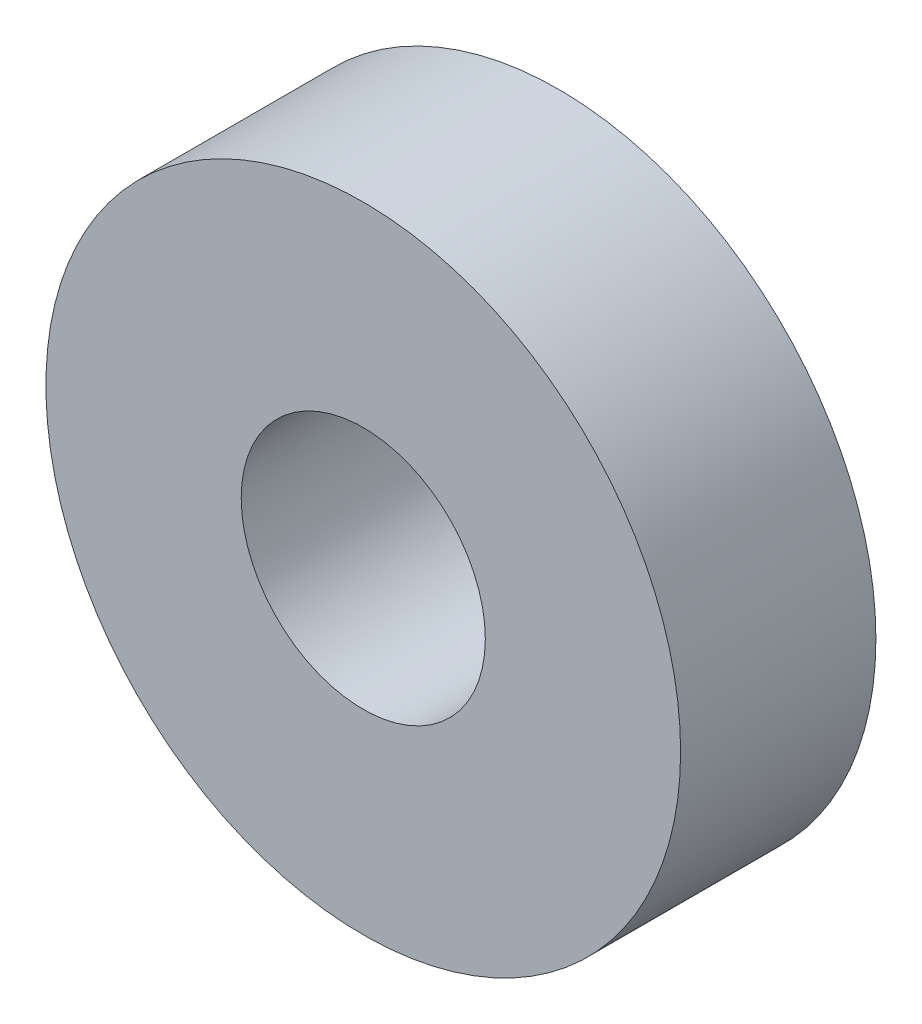
ISO-10303-21;
HEADER;
FILE_DESCRIPTION(('STEP AP214'),'2;1');
FILE_NAME('part.step','',(''),(''),'','','');
FILE_SCHEMA(('AUTOMOTIVE_DESIGN { 1 0 10303 214 1 1 1 1 }'));
ENDSEC;
DATA;
#1=APPLICATION_CONTEXT('core data for automotive mechanical design processes');
#2=APPLICATION_PROTOCOL_DEFINITION('international standard','automotive_design',2000,#1);
#3=PRODUCT_CONTEXT('',#1,'mechanical');
#4=PRODUCT('Part','Part','',(#3));
#5=PRODUCT_RELATED_PRODUCT_CATEGORY('part','',(#4));
#6=PRODUCT_DEFINITION_FORMATION('','',#4);
#7=PRODUCT_DEFINITION_CONTEXT('part definition',#1,'design');
#8=PRODUCT_DEFINITION('design','',#6,#7);
#9=PRODUCT_DEFINITION_SHAPE('','',#8);
#10=(LENGTH_UNIT() NAMED_UNIT(*) SI_UNIT(.MILLI.,.METRE.));
#11=(NAMED_UNIT(*) PLANE_ANGLE_UNIT() SI_UNIT($,.RADIAN.));
#12=(NAMED_UNIT(*) SI_UNIT($,.STERADIAN.) SOLID_ANGLE_UNIT());
#13=UNCERTAINTY_MEASURE_WITH_UNIT(LENGTH_MEASURE(1.E-05),#10,'distance_accuracy_value','');
#14=(GEOMETRIC_REPRESENTATION_CONTEXT(3) GLOBAL_UNCERTAINTY_ASSIGNED_CONTEXT((#13)) GLOBAL_UNIT_ASSIGNED_CONTEXT((#10,
#11,#12)) REPRESENTATION_CONTEXT('',''));
#15=CARTESIAN_POINT('',(0.,0.,0.));
#16=DIRECTION('',(0.,0.,1.));
#17=DIRECTION('',(1.,0.,0.));
#18=AXIS2_PLACEMENT_3D('',#15,#16,#17);
#19=CARTESIAN_POINT('',(0.,0.,4.));
#20=DIRECTION('',(0.,0.,1.));
#21=DIRECTION('',(1.,0.,0.));
#22=AXIS2_PLACEMENT_3D('',#19,#20,#21);
#23=PLANE('',#22);
#24=CARTESIAN_POINT('',(0.,0.,4.));
#25=DIRECTION('',(0.,0.,1.));
#26=DIRECTION('',(1.,0.,0.));
#27=AXIS2_PLACEMENT_3D('',#24,#25,#26);
#28=CIRCLE('',#27,6.5);
#29=CARTESIAN_POINT('',(6.5,0.,4.));
#30=VERTEX_POINT('',#29);
#31=EDGE_CURVE('E10',#30,#30,#28,.T.);
#32=ORIENTED_EDGE('',*,*,#31,.T.);
#33=EDGE_LOOP('',(#32));
#34=FACE_BOUND('',#33,.T.);
#35=CARTESIAN_POINT('',(0.,0.,4.));
#36=DIRECTION('',(0.,0.,1.));
#37=DIRECTION('',(1.,0.,0.));
#38=AXIS2_PLACEMENT_3D('',#35,#36,#37);
#39=CIRCLE('',#38,2.5);
#40=CARTESIAN_POINT('',(2.5,0.,4.));
#41=VERTEX_POINT('',#40);
#42=EDGE_CURVE('E46',#41,#41,#39,.T.);
#43=ORIENTED_EDGE('',*,*,#42,.F.);
#44=EDGE_LOOP('',(#43));
#45=FACE_BOUND('',#44,.T.);
#46=ADVANCED_FACE('F35',(#34,#45),#23,.T.);
#47=CARTESIAN_POINT('',(0.,0.,0.));
#48=DIRECTION('',(0.,0.,1.));
#49=DIRECTION('',(1.,0.,0.));
#50=AXIS2_PLACEMENT_3D('',#47,#48,#49);
#51=PLANE('',#50);
#52=CARTESIAN_POINT('',(0.,0.,0.));
#53=DIRECTION('',(0.,0.,1.));
#54=DIRECTION('',(1.,0.,0.));
#55=AXIS2_PLACEMENT_3D('',#52,#53,#54);
#56=CIRCLE('',#55,6.5);
#57=CARTESIAN_POINT('',(6.5,0.,0.));
#58=VERTEX_POINT('',#57);
#59=EDGE_CURVE('E39',#58,#58,#56,.T.);
#60=ORIENTED_EDGE('',*,*,#59,.F.);
#61=EDGE_LOOP('',(#60));
#62=FACE_BOUND('',#61,.T.);
#63=CARTESIAN_POINT('',(0.,0.,0.));
#64=DIRECTION('',(0.,0.,1.));
#65=DIRECTION('',(1.,0.,0.));
#66=AXIS2_PLACEMENT_3D('',#63,#64,#65);
#67=CIRCLE('',#66,2.5);
#68=CARTESIAN_POINT('',(2.5,0.,0.));
#69=VERTEX_POINT('',#68);
#70=EDGE_CURVE('E48',#69,#69,#67,.T.);
#71=ORIENTED_EDGE('',*,*,#70,.T.);
#72=EDGE_LOOP('',(#71));
#73=FACE_BOUND('',#72,.T.);
#74=ADVANCED_FACE('F58',(#62,#73),#51,.F.);
#75=CARTESIAN_POINT('',(0.,0.,4.));
#76=DIRECTION('',(0.,0.,-1.));
#77=DIRECTION('',(-1.,0.,0.));
#78=AXIS2_PLACEMENT_3D('',#75,#76,#77);
#79=CYLINDRICAL_SURFACE('',#78,6.5);
#80=ORIENTED_EDGE('',*,*,#31,.F.);
#81=EDGE_LOOP('',(#80));
#82=FACE_BOUND('',#81,.T.);
#83=ORIENTED_EDGE('',*,*,#59,.T.);
#84=EDGE_LOOP('',(#83));
#85=FACE_BOUND('',#84,.T.);
#86=ADVANCED_FACE('F37',(#82,#85),#79,.T.);
#87=CARTESIAN_POINT('',(0.,0.,4.));
#88=DIRECTION('',(0.,0.,-1.));
#89=DIRECTION('',(-1.,0.,0.));
#90=AXIS2_PLACEMENT_3D('',#87,#88,#89);
#91=CYLINDRICAL_SURFACE('',#90,2.5);
#92=ORIENTED_EDGE('',*,*,#42,.T.);
#93=EDGE_LOOP('',(#92));
#94=FACE_BOUND('',#93,.T.);
#95=ORIENTED_EDGE('',*,*,#70,.F.);
#96=EDGE_LOOP('',(#95));
#97=FACE_BOUND('',#96,.T.);
#98=ADVANCED_FACE('F54',(#94,#97),#91,.F.);
#99=CLOSED_SHELL('',(#46,#74,#86,#98));
#100=MANIFOLD_SOLID_BREP('B2',#99);
#101=ADVANCED_BREP_SHAPE_REPRESENTATION('',(#18,#100),#14);
#102=SHAPE_DEFINITION_REPRESENTATION(#9,#101);
ENDSEC;
END-ISO-10303-21;
